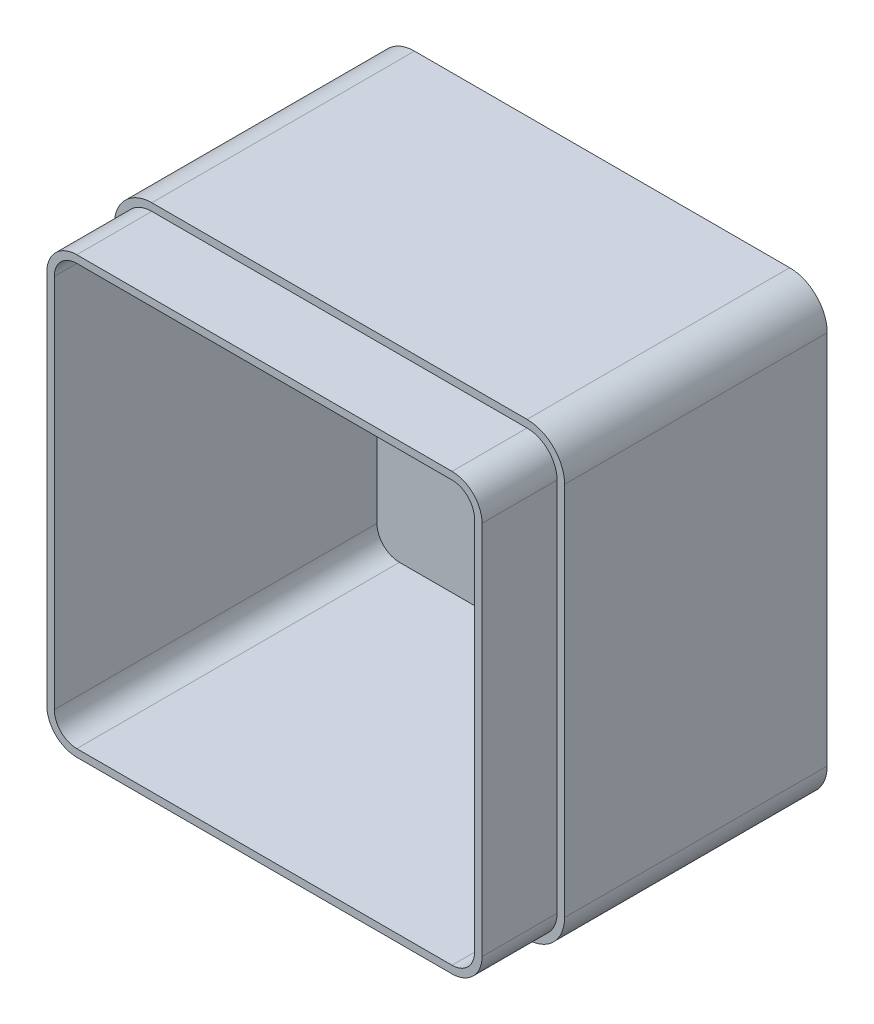
ISO-10303-21;
HEADER;
FILE_DESCRIPTION(('STEP AP214'),'2;1');
FILE_NAME('part.step','',(''),(''),'','','');
FILE_SCHEMA(('AUTOMOTIVE_DESIGN { 1 0 10303 214 1 1 1 1 }'));
ENDSEC;
DATA;
#1=APPLICATION_CONTEXT('core data for automotive mechanical design processes');
#2=APPLICATION_PROTOCOL_DEFINITION('international standard','automotive_design',2000,#1);
#3=PRODUCT_CONTEXT('',#1,'mechanical');
#4=PRODUCT('Part','Part','',(#3));
#5=PRODUCT_RELATED_PRODUCT_CATEGORY('part','',(#4));
#6=PRODUCT_DEFINITION_FORMATION('','',#4);
#7=PRODUCT_DEFINITION_CONTEXT('part definition',#1,'design');
#8=PRODUCT_DEFINITION('design','',#6,#7);
#9=PRODUCT_DEFINITION_SHAPE('','',#8);
#10=(LENGTH_UNIT() NAMED_UNIT(*) SI_UNIT(.MILLI.,.METRE.));
#11=(NAMED_UNIT(*) PLANE_ANGLE_UNIT() SI_UNIT($,.RADIAN.));
#12=(NAMED_UNIT(*) SI_UNIT($,.STERADIAN.) SOLID_ANGLE_UNIT());
#13=UNCERTAINTY_MEASURE_WITH_UNIT(LENGTH_MEASURE(1.E-05),#10,'distance_accuracy_value','');
#14=(GEOMETRIC_REPRESENTATION_CONTEXT(3) GLOBAL_UNCERTAINTY_ASSIGNED_CONTEXT((#13)) GLOBAL_UNIT_ASSIGNED_CONTEXT((#10,
#11,#12)) REPRESENTATION_CONTEXT('',''));
#15=CARTESIAN_POINT('',(0.,0.,0.));
#16=DIRECTION('',(0.,0.,1.));
#17=DIRECTION('',(1.,0.,0.));
#18=AXIS2_PLACEMENT_3D('',#15,#16,#17);
#19=CARTESIAN_POINT('',(0.,0.,90.));
#20=DIRECTION('',(0.,0.,1.));
#21=DIRECTION('',(1.,0.,0.));
#22=AXIS2_PLACEMENT_3D('',#19,#20,#21);
#23=PLANE('',#22);
#24=DIRECTION('',(0.,-1.,0.));
#25=VECTOR('',#24,1.);
#26=CARTESIAN_POINT('',(-116.,0.,90.));
#27=LINE('',#26,#25);
#28=CARTESIAN_POINT('',(-116.,110.,90.));
#29=VERTEX_POINT('',#28);
#30=CARTESIAN_POINT('',(-116.,9.99999999999999,90.));
#31=VERTEX_POINT('',#30);
#32=EDGE_CURVE('E391',#29,#31,#27,.T.);
#33=ORIENTED_EDGE('',*,*,#32,.F.);
#34=CARTESIAN_POINT('',(-110.,110.,90.));
#35=DIRECTION('',(0.,0.,1.));
#36=DIRECTION('',(1.,0.,0.));
#37=AXIS2_PLACEMENT_3D('',#34,#35,#36);
#38=CIRCLE('',#37,6.);
#39=CARTESIAN_POINT('',(-110.,116.,90.));
#40=VERTEX_POINT('',#39);
#41=EDGE_CURVE('E392',#40,#29,#38,.T.);
#42=ORIENTED_EDGE('',*,*,#41,.F.);
#43=DIRECTION('',(-1.,0.,0.));
#44=VECTOR('',#43,1.);
#45=CARTESIAN_POINT('',(0.,116.,90.));
#46=LINE('',#45,#44);
#47=CARTESIAN_POINT('',(-10.,116.,90.));
#48=VERTEX_POINT('',#47);
#49=EDGE_CURVE('E385',#48,#40,#46,.T.);
#50=ORIENTED_EDGE('',*,*,#49,.F.);
#51=CARTESIAN_POINT('',(-10.,110.,90.));
#52=DIRECTION('',(0.,0.,1.));
#53=DIRECTION('',(1.,0.,0.));
#54=AXIS2_PLACEMENT_3D('',#51,#52,#53);
#55=CIRCLE('',#54,6.);
#56=CARTESIAN_POINT('',(-4.,110.,90.));
#57=VERTEX_POINT('',#56);
#58=EDGE_CURVE('E374',#57,#48,#55,.T.);
#59=ORIENTED_EDGE('',*,*,#58,.F.);
#60=DIRECTION('',(0.,1.,0.));
#61=VECTOR('',#60,1.);
#62=CARTESIAN_POINT('',(-4.,0.,90.));
#63=LINE('',#62,#61);
#64=CARTESIAN_POINT('',(-4.,9.99999999999999,90.));
#65=VERTEX_POINT('',#64);
#66=EDGE_CURVE('E338',#65,#57,#63,.T.);
#67=ORIENTED_EDGE('',*,*,#66,.F.);
#68=CARTESIAN_POINT('',(-10.,10.,90.));
#69=DIRECTION('',(0.,0.,1.));
#70=DIRECTION('',(1.,0.,0.));
#71=AXIS2_PLACEMENT_3D('',#68,#69,#70);
#72=CIRCLE('',#71,6.);
#73=CARTESIAN_POINT('',(-9.99999999999999,4.,90.));
#74=VERTEX_POINT('',#73);
#75=EDGE_CURVE('E388',#74,#65,#72,.T.);
#76=ORIENTED_EDGE('',*,*,#75,.F.);
#77=DIRECTION('',(1.,0.,0.));
#78=VECTOR('',#77,1.);
#79=CARTESIAN_POINT('',(0.,4.,90.));
#80=LINE('',#79,#78);
#81=CARTESIAN_POINT('',(-110.,4.,90.));
#82=VERTEX_POINT('',#81);
#83=EDGE_CURVE('E381',#82,#74,#80,.T.);
#84=ORIENTED_EDGE('',*,*,#83,.F.);
#85=CARTESIAN_POINT('',(-110.,10.,90.));
#86=DIRECTION('',(0.,0.,1.));
#87=DIRECTION('',(1.,0.,0.));
#88=AXIS2_PLACEMENT_3D('',#85,#86,#87);
#89=CIRCLE('',#88,6.);
#90=EDGE_CURVE('E367',#31,#82,#89,.T.);
#91=ORIENTED_EDGE('',*,*,#90,.F.);
#92=EDGE_LOOP('',(#33,#42,#50,#59,#67,#76,#84,#91));
#93=FACE_BOUND('',#92,.T.);
#94=DIRECTION('',(-1.,0.,0.));
#95=VECTOR('',#94,1.);
#96=CARTESIAN_POINT('',(-10.,118.,90.));
#97=LINE('',#96,#95);
#98=CARTESIAN_POINT('',(-10.,118.,90.));
#99=VERTEX_POINT('',#98);
#100=CARTESIAN_POINT('',(-110.,118.,90.));
#101=VERTEX_POINT('',#100);
#102=EDGE_CURVE('E229',#99,#101,#97,.T.);
#103=ORIENTED_EDGE('',*,*,#102,.T.);
#104=CARTESIAN_POINT('',(-110.,110.,90.));
#105=DIRECTION('',(0.,0.,1.));
#106=DIRECTION('',(1.,0.,0.));
#107=AXIS2_PLACEMENT_3D('',#104,#105,#106);
#108=CIRCLE('',#107,8.);
#109=CARTESIAN_POINT('',(-118.,110.,90.));
#110=VERTEX_POINT('',#109);
#111=EDGE_CURVE('E256',#101,#110,#108,.T.);
#112=ORIENTED_EDGE('',*,*,#111,.T.);
#113=DIRECTION('',(0.,-1.,0.));
#114=VECTOR('',#113,1.);
#115=CARTESIAN_POINT('',(-118.,110.,90.));
#116=LINE('',#115,#114);
#117=CARTESIAN_POINT('',(-118.,9.99999999999999,90.));
#118=VERTEX_POINT('',#117);
#119=EDGE_CURVE('E206',#110,#118,#116,.T.);
#120=ORIENTED_EDGE('',*,*,#119,.T.);
#121=CARTESIAN_POINT('',(-110.,10.,90.));
#122=DIRECTION('',(0.,0.,1.));
#123=DIRECTION('',(1.,0.,0.));
#124=AXIS2_PLACEMENT_3D('',#121,#122,#123);
#125=CIRCLE('',#124,7.99999999999999);
#126=CARTESIAN_POINT('',(-110.,2.,90.));
#127=VERTEX_POINT('',#126);
#128=EDGE_CURVE('E55',#118,#127,#125,.T.);
#129=ORIENTED_EDGE('',*,*,#128,.T.);
#130=DIRECTION('',(1.,0.,0.));
#131=VECTOR('',#130,1.);
#132=CARTESIAN_POINT('',(-110.,2.,90.));
#133=LINE('',#132,#131);
#134=CARTESIAN_POINT('',(-9.99999999999999,2.,90.));
#135=VERTEX_POINT('',#134);
#136=EDGE_CURVE('E263',#127,#135,#133,.T.);
#137=ORIENTED_EDGE('',*,*,#136,.T.);
#138=CARTESIAN_POINT('',(-10.,10.,90.));
#139=DIRECTION('',(0.,0.,1.));
#140=DIRECTION('',(1.,0.,0.));
#141=AXIS2_PLACEMENT_3D('',#138,#139,#140);
#142=CIRCLE('',#141,8.);
#143=CARTESIAN_POINT('',(-2.,10.,90.));
#144=VERTEX_POINT('',#143);
#145=EDGE_CURVE('E267',#135,#144,#142,.T.);
#146=ORIENTED_EDGE('',*,*,#145,.T.);
#147=DIRECTION('',(0.,1.,0.));
#148=VECTOR('',#147,1.);
#149=CARTESIAN_POINT('',(-2.,9.99999999999999,90.));
#150=LINE('',#149,#148);
#151=CARTESIAN_POINT('',(-2.,110.,90.));
#152=VERTEX_POINT('',#151);
#153=EDGE_CURVE('E271',#144,#152,#150,.T.);
#154=ORIENTED_EDGE('',*,*,#153,.T.);
#155=CARTESIAN_POINT('',(-10.,110.,90.));
#156=DIRECTION('',(0.,0.,1.));
#157=DIRECTION('',(1.,0.,0.));
#158=AXIS2_PLACEMENT_3D('',#155,#156,#157);
#159=CIRCLE('',#158,7.99999999999999);
#160=EDGE_CURVE('E233',#152,#99,#159,.T.);
#161=ORIENTED_EDGE('',*,*,#160,.T.);
#162=EDGE_LOOP('',(#103,#112,#120,#129,#137,#146,#154,#161));
#163=FACE_BOUND('',#162,.T.);
#164=ADVANCED_FACE('F39',(#93,#163),#23,.T.);
#165=CARTESIAN_POINT('',(-4.,0.,90.));
#166=DIRECTION('',(-1.,0.,0.));
#167=DIRECTION('',(0.,0.,1.));
#168=AXIS2_PLACEMENT_3D('',#165,#166,#167);
#169=PLANE('',#168);
#170=ORIENTED_EDGE('',*,*,#66,.T.);
#171=DIRECTION('',(0.,0.,1.));
#172=VECTOR('',#171,1.);
#173=CARTESIAN_POINT('',(-4.,110.,90.));
#174=LINE('',#173,#172);
#175=CARTESIAN_POINT('',(-4.,110.,4.));
#176=VERTEX_POINT('',#175);
#177=EDGE_CURVE('E326',#176,#57,#174,.T.);
#178=ORIENTED_EDGE('',*,*,#177,.F.);
#179=DIRECTION('',(0.,1.,0.));
#180=VECTOR('',#179,1.);
#181=CARTESIAN_POINT('',(-4.,0.,4.));
#182=LINE('',#181,#180);
#183=CARTESIAN_POINT('',(-4.,9.99999999999999,4.));
#184=VERTEX_POINT('',#183);
#185=EDGE_CURVE('E320',#184,#176,#182,.T.);
#186=ORIENTED_EDGE('',*,*,#185,.F.);
#187=DIRECTION('',(0.,0.,1.));
#188=VECTOR('',#187,1.);
#189=CARTESIAN_POINT('',(-4.,9.99999999999999,90.));
#190=LINE('',#189,#188);
#191=EDGE_CURVE('E321',#65,#184,#190,.F.);
#192=ORIENTED_EDGE('',*,*,#191,.F.);
#193=EDGE_LOOP('',(#170,#178,#186,#192));
#194=FACE_BOUND('',#193,.T.);
#195=ADVANCED_FACE('F504',(#194),#169,.T.);
#196=CARTESIAN_POINT('',(0.,116.,90.));
#197=DIRECTION('',(0.,-1.,0.));
#198=DIRECTION('',(1.,0.,0.));
#199=AXIS2_PLACEMENT_3D('',#196,#197,#198);
#200=PLANE('',#199);
#201=DIRECTION('',(-1.,0.,0.));
#202=VECTOR('',#201,1.);
#203=CARTESIAN_POINT('',(0.,116.,4.));
#204=LINE('',#203,#202);
#205=CARTESIAN_POINT('',(-10.,116.,4.));
#206=VERTEX_POINT('',#205);
#207=CARTESIAN_POINT('',(-110.,116.,4.));
#208=VERTEX_POINT('',#207);
#209=EDGE_CURVE('E330',#206,#208,#204,.T.);
#210=ORIENTED_EDGE('',*,*,#209,.F.);
#211=DIRECTION('',(0.,0.,1.));
#212=VECTOR('',#211,1.);
#213=CARTESIAN_POINT('',(-10.,116.,90.));
#214=LINE('',#213,#212);
#215=EDGE_CURVE('E363',#48,#206,#214,.F.);
#216=ORIENTED_EDGE('',*,*,#215,.F.);
#217=ORIENTED_EDGE('',*,*,#49,.T.);
#218=DIRECTION('',(0.,0.,1.));
#219=VECTOR('',#218,1.);
#220=CARTESIAN_POINT('',(-110.,116.,90.));
#221=LINE('',#220,#219);
#222=EDGE_CURVE('E333',#208,#40,#221,.T.);
#223=ORIENTED_EDGE('',*,*,#222,.F.);
#224=EDGE_LOOP('',(#210,#216,#217,#223));
#225=FACE_BOUND('',#224,.T.);
#226=ADVANCED_FACE('F509',(#225),#200,.T.);
#227=CARTESIAN_POINT('',(-116.,0.,90.));
#228=DIRECTION('',(1.,0.,0.));
#229=DIRECTION('',(0.,0.,-1.));
#230=AXIS2_PLACEMENT_3D('',#227,#228,#229);
#231=PLANE('',#230);
#232=DIRECTION('',(0.,-1.,0.));
#233=VECTOR('',#232,1.);
#234=CARTESIAN_POINT('',(-116.,0.,4.));
#235=LINE('',#234,#233);
#236=CARTESIAN_POINT('',(-116.,110.,4.));
#237=VERTEX_POINT('',#236);
#238=CARTESIAN_POINT('',(-116.,9.99999999999999,4.));
#239=VERTEX_POINT('',#238);
#240=EDGE_CURVE('E339',#237,#239,#235,.T.);
#241=ORIENTED_EDGE('',*,*,#240,.F.);
#242=DIRECTION('',(0.,0.,-1.));
#243=VECTOR('',#242,1.);
#244=CARTESIAN_POINT('',(-116.,110.,90.));
#245=LINE('',#244,#243);
#246=EDGE_CURVE('E343',#29,#237,#245,.T.);
#247=ORIENTED_EDGE('',*,*,#246,.F.);
#248=ORIENTED_EDGE('',*,*,#32,.T.);
#249=DIRECTION('',(0.,0.,-1.));
#250=VECTOR('',#249,1.);
#251=CARTESIAN_POINT('',(-116.,9.99999999999999,90.));
#252=LINE('',#251,#250);
#253=EDGE_CURVE('E371',#239,#31,#252,.F.);
#254=ORIENTED_EDGE('',*,*,#253,.F.);
#255=EDGE_LOOP('',(#241,#247,#248,#254));
#256=FACE_BOUND('',#255,.T.);
#257=ADVANCED_FACE('F538',(#256),#231,.T.);
#258=CARTESIAN_POINT('',(0.,4.,90.));
#259=DIRECTION('',(0.,1.,0.));
#260=DIRECTION('',(0.,0.,1.));
#261=AXIS2_PLACEMENT_3D('',#258,#259,#260);
#262=PLANE('',#261);
#263=ORIENTED_EDGE('',*,*,#83,.T.);
#264=DIRECTION('',(0.,0.,1.));
#265=VECTOR('',#264,1.);
#266=CARTESIAN_POINT('',(-9.99999999999999,4.,90.));
#267=LINE('',#266,#265);
#268=CARTESIAN_POINT('',(-9.99999999999999,4.,4.));
#269=VERTEX_POINT('',#268);
#270=EDGE_CURVE('E378',#269,#74,#267,.T.);
#271=ORIENTED_EDGE('',*,*,#270,.F.);
#272=DIRECTION('',(1.,0.,0.));
#273=VECTOR('',#272,1.);
#274=CARTESIAN_POINT('',(0.,4.,4.));
#275=LINE('',#274,#273);
#276=CARTESIAN_POINT('',(-110.,4.,4.));
#277=VERTEX_POINT('',#276);
#278=EDGE_CURVE('E334',#277,#269,#275,.T.);
#279=ORIENTED_EDGE('',*,*,#278,.F.);
#280=DIRECTION('',(0.,0.,1.));
#281=VECTOR('',#280,1.);
#282=CARTESIAN_POINT('',(-110.,4.,90.));
#283=LINE('',#282,#281);
#284=EDGE_CURVE('E357',#82,#277,#283,.F.);
#285=ORIENTED_EDGE('',*,*,#284,.F.);
#286=EDGE_LOOP('',(#263,#271,#279,#285));
#287=FACE_BOUND('',#286,.T.);
#288=ADVANCED_FACE('F534',(#287),#262,.T.);
#289=CARTESIAN_POINT('',(0.,0.,4.));
#290=DIRECTION('',(0.,0.,1.));
#291=DIRECTION('',(1.,0.,0.));
#292=AXIS2_PLACEMENT_3D('',#289,#290,#291);
#293=PLANE('',#292);
#294=ORIENTED_EDGE('',*,*,#278,.T.);
#295=CARTESIAN_POINT('',(-10.,10.,4.));
#296=DIRECTION('',(0.,0.,1.));
#297=DIRECTION('',(1.,0.,0.));
#298=AXIS2_PLACEMENT_3D('',#295,#296,#297);
#299=CIRCLE('',#298,6.);
#300=EDGE_CURVE('E350',#184,#269,#299,.F.);
#301=ORIENTED_EDGE('',*,*,#300,.F.);
#302=ORIENTED_EDGE('',*,*,#185,.T.);
#303=CARTESIAN_POINT('',(-10.,110.,4.));
#304=DIRECTION('',(0.,0.,1.));
#305=DIRECTION('',(1.,0.,0.));
#306=AXIS2_PLACEMENT_3D('',#303,#304,#305);
#307=CIRCLE('',#306,6.);
#308=EDGE_CURVE('E354',#206,#176,#307,.F.);
#309=ORIENTED_EDGE('',*,*,#308,.F.);
#310=ORIENTED_EDGE('',*,*,#209,.T.);
#311=CARTESIAN_POINT('',(-110.,110.,4.));
#312=DIRECTION('',(0.,0.,1.));
#313=DIRECTION('',(1.,0.,0.));
#314=AXIS2_PLACEMENT_3D('',#311,#312,#313);
#315=CIRCLE('',#314,6.);
#316=EDGE_CURVE('E344',#237,#208,#315,.F.);
#317=ORIENTED_EDGE('',*,*,#316,.F.);
#318=ORIENTED_EDGE('',*,*,#240,.T.);
#319=CARTESIAN_POINT('',(-110.,10.,4.));
#320=DIRECTION('',(0.,0.,1.));
#321=DIRECTION('',(1.,0.,0.));
#322=AXIS2_PLACEMENT_3D('',#319,#320,#321);
#323=CIRCLE('',#322,6.);
#324=EDGE_CURVE('E340',#277,#239,#323,.F.);
#325=ORIENTED_EDGE('',*,*,#324,.F.);
#326=EDGE_LOOP('',(#294,#301,#302,#309,#310,#317,#318,#325));
#327=FACE_BOUND('',#326,.T.);
#328=ADVANCED_FACE('F530',(#327),#293,.T.);
#329=CARTESIAN_POINT('',(-110.,10.,90.));
#330=DIRECTION('',(0.,0.,-1.));
#331=DIRECTION('',(-1.,0.,0.));
#332=AXIS2_PLACEMENT_3D('',#329,#330,#331);
#333=CYLINDRICAL_SURFACE('',#332,6.);
#334=ORIENTED_EDGE('',*,*,#90,.T.);
#335=ORIENTED_EDGE('',*,*,#284,.T.);
#336=ORIENTED_EDGE('',*,*,#324,.T.);
#337=ORIENTED_EDGE('',*,*,#253,.T.);
#338=EDGE_LOOP('',(#334,#335,#336,#337));
#339=FACE_BOUND('',#338,.T.);
#340=ADVANCED_FACE('F526',(#339),#333,.F.);
#341=CARTESIAN_POINT('',(-110.,110.,90.));
#342=DIRECTION('',(0.,0.,-1.));
#343=DIRECTION('',(-1.,0.,0.));
#344=AXIS2_PLACEMENT_3D('',#341,#342,#343);
#345=CYLINDRICAL_SURFACE('',#344,6.);
#346=ORIENTED_EDGE('',*,*,#41,.T.);
#347=ORIENTED_EDGE('',*,*,#246,.T.);
#348=ORIENTED_EDGE('',*,*,#316,.T.);
#349=ORIENTED_EDGE('',*,*,#222,.T.);
#350=EDGE_LOOP('',(#346,#347,#348,#349));
#351=FACE_BOUND('',#350,.T.);
#352=ADVANCED_FACE('F522',(#351),#345,.F.);
#353=CARTESIAN_POINT('',(-10.,10.,90.));
#354=DIRECTION('',(0.,0.,-1.));
#355=DIRECTION('',(-1.,0.,0.));
#356=AXIS2_PLACEMENT_3D('',#353,#354,#355);
#357=CYLINDRICAL_SURFACE('',#356,6.);
#358=ORIENTED_EDGE('',*,*,#75,.T.);
#359=ORIENTED_EDGE('',*,*,#191,.T.);
#360=ORIENTED_EDGE('',*,*,#300,.T.);
#361=ORIENTED_EDGE('',*,*,#270,.T.);
#362=EDGE_LOOP('',(#358,#359,#360,#361));
#363=FACE_BOUND('',#362,.T.);
#364=ADVANCED_FACE('F518',(#363),#357,.F.);
#365=CARTESIAN_POINT('',(-10.,110.,90.));
#366=DIRECTION('',(0.,0.,-1.));
#367=DIRECTION('',(-1.,0.,0.));
#368=AXIS2_PLACEMENT_3D('',#365,#366,#367);
#369=CYLINDRICAL_SURFACE('',#368,6.);
#370=ORIENTED_EDGE('',*,*,#58,.T.);
#371=ORIENTED_EDGE('',*,*,#215,.T.);
#372=ORIENTED_EDGE('',*,*,#308,.T.);
#373=ORIENTED_EDGE('',*,*,#177,.T.);
#374=EDGE_LOOP('',(#370,#371,#372,#373));
#375=FACE_BOUND('',#374,.T.);
#376=ADVANCED_FACE('F515',(#375),#369,.F.);
#377=CARTESIAN_POINT('',(-110.,110.,70.));
#378=DIRECTION('',(0.,0.,1.));
#379=DIRECTION('',(1.,0.,0.));
#380=AXIS2_PLACEMENT_3D('',#377,#378,#379);
#381=PLANE('',#380);
#382=DIRECTION('',(-1.,0.,0.));
#383=VECTOR('',#382,1.);
#384=CARTESIAN_POINT('',(-10.,118.,70.));
#385=LINE('',#384,#383);
#386=CARTESIAN_POINT('',(-10.,118.,70.));
#387=VERTEX_POINT('',#386);
#388=CARTESIAN_POINT('',(-110.,118.,70.));
#389=VERTEX_POINT('',#388);
#390=EDGE_CURVE('E213',#387,#389,#385,.T.);
#391=ORIENTED_EDGE('',*,*,#390,.F.);
#392=CARTESIAN_POINT('',(-10.,110.,70.));
#393=DIRECTION('',(0.,0.,1.));
#394=DIRECTION('',(1.,0.,0.));
#395=AXIS2_PLACEMENT_3D('',#392,#393,#394);
#396=CIRCLE('',#395,7.99999999999999);
#397=CARTESIAN_POINT('',(-2.,110.,70.));
#398=VERTEX_POINT('',#397);
#399=EDGE_CURVE('E250',#398,#387,#396,.T.);
#400=ORIENTED_EDGE('',*,*,#399,.F.);
#401=DIRECTION('',(0.,1.,0.));
#402=VECTOR('',#401,1.);
#403=CARTESIAN_POINT('',(-2.,9.99999999999999,70.));
#404=LINE('',#403,#402);
#405=CARTESIAN_POINT('',(-2.,10.,70.));
#406=VERTEX_POINT('',#405);
#407=EDGE_CURVE('E246',#406,#398,#404,.T.);
#408=ORIENTED_EDGE('',*,*,#407,.F.);
#409=CARTESIAN_POINT('',(-10.,10.,70.));
#410=DIRECTION('',(0.,0.,1.));
#411=DIRECTION('',(1.,0.,0.));
#412=AXIS2_PLACEMENT_3D('',#409,#410,#411);
#413=CIRCLE('',#412,8.);
#414=CARTESIAN_POINT('',(-9.99999999999999,2.,70.));
#415=VERTEX_POINT('',#414);
#416=EDGE_CURVE('E242',#415,#406,#413,.T.);
#417=ORIENTED_EDGE('',*,*,#416,.F.);
#418=DIRECTION('',(1.,0.,0.));
#419=VECTOR('',#418,1.);
#420=CARTESIAN_POINT('',(-110.,2.,70.));
#421=LINE('',#420,#419);
#422=CARTESIAN_POINT('',(-110.,2.,70.));
#423=VERTEX_POINT('',#422);
#424=EDGE_CURVE('E238',#423,#415,#421,.T.);
#425=ORIENTED_EDGE('',*,*,#424,.F.);
#426=CARTESIAN_POINT('',(-110.,10.,70.));
#427=DIRECTION('',(0.,0.,1.));
#428=DIRECTION('',(1.,0.,0.));
#429=AXIS2_PLACEMENT_3D('',#426,#427,#428);
#430=CIRCLE('',#429,7.99999999999999);
#431=CARTESIAN_POINT('',(-118.,9.99999999999999,70.));
#432=VERTEX_POINT('',#431);
#433=EDGE_CURVE('E223',#432,#423,#430,.T.);
#434=ORIENTED_EDGE('',*,*,#433,.F.);
#435=DIRECTION('',(0.,-1.,0.));
#436=VECTOR('',#435,1.);
#437=CARTESIAN_POINT('',(-118.,110.,70.));
#438=LINE('',#437,#436);
#439=CARTESIAN_POINT('',(-118.,110.,70.));
#440=VERTEX_POINT('',#439);
#441=EDGE_CURVE('E204',#440,#432,#438,.T.);
#442=ORIENTED_EDGE('',*,*,#441,.F.);
#443=CARTESIAN_POINT('',(-110.,110.,70.));
#444=DIRECTION('',(0.,0.,1.));
#445=DIRECTION('',(1.,0.,0.));
#446=AXIS2_PLACEMENT_3D('',#443,#444,#445);
#447=CIRCLE('',#446,8.);
#448=EDGE_CURVE('E219',#389,#440,#447,.T.);
#449=ORIENTED_EDGE('',*,*,#448,.F.);
#450=EDGE_LOOP('',(#391,#400,#408,#417,#425,#434,#442,#449));
#451=FACE_BOUND('',#450,.T.);
#452=CARTESIAN_POINT('',(-110.,110.,70.));
#453=DIRECTION('',(0.,0.,1.));
#454=DIRECTION('',(1.,0.,0.));
#455=AXIS2_PLACEMENT_3D('',#452,#453,#454);
#456=CIRCLE('',#455,9.99999999999999);
#457=CARTESIAN_POINT('',(-110.,120.,70.));
#458=VERTEX_POINT('',#457);
#459=CARTESIAN_POINT('',(-120.,110.,70.));
#460=VERTEX_POINT('',#459);
#461=EDGE_CURVE('E280',#458,#460,#456,.T.);
#462=ORIENTED_EDGE('',*,*,#461,.T.);
#463=DIRECTION('',(0.,-1.,0.));
#464=VECTOR('',#463,1.);
#465=CARTESIAN_POINT('',(-120.,110.,70.));
#466=LINE('',#465,#464);
#467=CARTESIAN_POINT('',(-120.,9.99999999999999,70.));
#468=VERTEX_POINT('',#467);
#469=EDGE_CURVE('E300',#460,#468,#466,.T.);
#470=ORIENTED_EDGE('',*,*,#469,.T.);
#471=CARTESIAN_POINT('',(-110.,10.,70.));
#472=DIRECTION('',(0.,0.,1.));
#473=DIRECTION('',(1.,0.,0.));
#474=AXIS2_PLACEMENT_3D('',#471,#472,#473);
#475=CIRCLE('',#474,9.99999999999999);
#476=CARTESIAN_POINT('',(-110.,0.,70.));
#477=VERTEX_POINT('',#476);
#478=EDGE_CURVE('E303',#468,#477,#475,.T.);
#479=ORIENTED_EDGE('',*,*,#478,.T.);
#480=DIRECTION('',(1.,0.,0.));
#481=VECTOR('',#480,1.);
#482=CARTESIAN_POINT('',(-110.,0.,70.));
#483=LINE('',#482,#481);
#484=CARTESIAN_POINT('',(-10.,0.,70.));
#485=VERTEX_POINT('',#484);
#486=EDGE_CURVE('E306',#477,#485,#483,.T.);
#487=ORIENTED_EDGE('',*,*,#486,.T.);
#488=CARTESIAN_POINT('',(-10.,10.,70.));
#489=DIRECTION('',(0.,0.,1.));
#490=DIRECTION('',(1.,0.,0.));
#491=AXIS2_PLACEMENT_3D('',#488,#489,#490);
#492=CIRCLE('',#491,10.);
#493=CARTESIAN_POINT('',(0.,10.,70.));
#494=VERTEX_POINT('',#493);
#495=EDGE_CURVE('E309',#485,#494,#492,.T.);
#496=ORIENTED_EDGE('',*,*,#495,.T.);
#497=DIRECTION('',(0.,1.,0.));
#498=VECTOR('',#497,1.);
#499=CARTESIAN_POINT('',(0.,10.,70.));
#500=LINE('',#499,#498);
#501=CARTESIAN_POINT('',(0.,110.,70.));
#502=VERTEX_POINT('',#501);
#503=EDGE_CURVE('E63',#494,#502,#500,.T.);
#504=ORIENTED_EDGE('',*,*,#503,.T.);
#505=CARTESIAN_POINT('',(-10.,110.,70.));
#506=DIRECTION('',(0.,0.,1.));
#507=DIRECTION('',(1.,0.,0.));
#508=AXIS2_PLACEMENT_3D('',#505,#506,#507);
#509=CIRCLE('',#508,9.99999999999999);
#510=CARTESIAN_POINT('',(-10.,120.,70.));
#511=VERTEX_POINT('',#510);
#512=EDGE_CURVE('E314',#502,#511,#509,.T.);
#513=ORIENTED_EDGE('',*,*,#512,.T.);
#514=DIRECTION('',(-1.,0.,0.));
#515=VECTOR('',#514,1.);
#516=CARTESIAN_POINT('',(-10.,120.,70.));
#517=LINE('',#516,#515);
#518=EDGE_CURVE('E317',#511,#458,#517,.T.);
#519=ORIENTED_EDGE('',*,*,#518,.T.);
#520=EDGE_LOOP('',(#462,#470,#479,#487,#496,#504,#513,#519));
#521=FACE_BOUND('',#520,.T.);
#522=ADVANCED_FACE('F218',(#451,#521),#381,.T.);
#523=CARTESIAN_POINT('',(-110.,110.,70.));
#524=DIRECTION('',(0.,0.,1.));
#525=DIRECTION('',(1.,0.,0.));
#526=AXIS2_PLACEMENT_3D('',#523,#524,#525);
#527=CYLINDRICAL_SURFACE('',#526,8.);
#528=ORIENTED_EDGE('',*,*,#111,.F.);
#529=DIRECTION('',(0.,0.,1.));
#530=VECTOR('',#529,1.);
#531=CARTESIAN_POINT('',(-110.,118.,70.));
#532=LINE('',#531,#530);
#533=EDGE_CURVE('E227',#389,#101,#532,.T.);
#534=ORIENTED_EDGE('',*,*,#533,.F.);
#535=ORIENTED_EDGE('',*,*,#448,.T.);
#536=DIRECTION('',(0.,0.,1.));
#537=VECTOR('',#536,1.);
#538=CARTESIAN_POINT('',(-118.,110.,70.));
#539=LINE('',#538,#537);
#540=EDGE_CURVE('E201',#440,#110,#539,.T.);
#541=ORIENTED_EDGE('',*,*,#540,.T.);
#542=EDGE_LOOP('',(#528,#534,#535,#541));
#543=FACE_BOUND('',#542,.T.);
#544=ADVANCED_FACE('F226',(#543),#527,.T.);
#545=CARTESIAN_POINT('',(-10.,118.,70.));
#546=DIRECTION('',(0.,1.,0.));
#547=DIRECTION('',(0.,0.,1.));
#548=AXIS2_PLACEMENT_3D('',#545,#546,#547);
#549=PLANE('',#548);
#550=ORIENTED_EDGE('',*,*,#102,.F.);
#551=DIRECTION('',(0.,0.,1.));
#552=VECTOR('',#551,1.);
#553=CARTESIAN_POINT('',(-10.,118.,70.));
#554=LINE('',#553,#552);
#555=EDGE_CURVE('E281',#387,#99,#554,.T.);
#556=ORIENTED_EDGE('',*,*,#555,.F.);
#557=ORIENTED_EDGE('',*,*,#390,.T.);
#558=ORIENTED_EDGE('',*,*,#533,.T.);
#559=EDGE_LOOP('',(#550,#556,#557,#558));
#560=FACE_BOUND('',#559,.T.);
#561=ADVANCED_FACE('F549',(#560),#549,.T.);
#562=CARTESIAN_POINT('',(-10.,110.,70.));
#563=DIRECTION('',(0.,0.,1.));
#564=DIRECTION('',(1.,0.,0.));
#565=AXIS2_PLACEMENT_3D('',#562,#563,#564);
#566=CYLINDRICAL_SURFACE('',#565,7.99999999999999);
#567=ORIENTED_EDGE('',*,*,#160,.F.);
#568=DIRECTION('',(0.,0.,1.));
#569=VECTOR('',#568,1.);
#570=CARTESIAN_POINT('',(-2.,110.,70.));
#571=LINE('',#570,#569);
#572=EDGE_CURVE('E284',#398,#152,#571,.T.);
#573=ORIENTED_EDGE('',*,*,#572,.F.);
#574=ORIENTED_EDGE('',*,*,#399,.T.);
#575=ORIENTED_EDGE('',*,*,#555,.T.);
#576=EDGE_LOOP('',(#567,#573,#574,#575));
#577=FACE_BOUND('',#576,.T.);
#578=ADVANCED_FACE('F564',(#577),#566,.T.);
#579=CARTESIAN_POINT('',(-2.,9.99999999999999,70.));
#580=DIRECTION('',(1.,0.,0.));
#581=DIRECTION('',(0.,0.,-1.));
#582=AXIS2_PLACEMENT_3D('',#579,#580,#581);
#583=PLANE('',#582);
#584=ORIENTED_EDGE('',*,*,#153,.F.);
#585=DIRECTION('',(0.,0.,1.));
#586=VECTOR('',#585,1.);
#587=CARTESIAN_POINT('',(-2.,10.,70.));
#588=LINE('',#587,#586);
#589=EDGE_CURVE('E287',#406,#144,#588,.T.);
#590=ORIENTED_EDGE('',*,*,#589,.F.);
#591=ORIENTED_EDGE('',*,*,#407,.T.);
#592=ORIENTED_EDGE('',*,*,#572,.T.);
#593=EDGE_LOOP('',(#584,#590,#591,#592));
#594=FACE_BOUND('',#593,.T.);
#595=ADVANCED_FACE('F560',(#594),#583,.T.);
#596=CARTESIAN_POINT('',(-10.,10.,70.));
#597=DIRECTION('',(0.,0.,1.));
#598=DIRECTION('',(1.,0.,0.));
#599=AXIS2_PLACEMENT_3D('',#596,#597,#598);
#600=CYLINDRICAL_SURFACE('',#599,8.);
#601=ORIENTED_EDGE('',*,*,#145,.F.);
#602=DIRECTION('',(0.,0.,1.));
#603=VECTOR('',#602,1.);
#604=CARTESIAN_POINT('',(-9.99999999999999,2.,70.));
#605=LINE('',#604,#603);
#606=EDGE_CURVE('E290',#415,#135,#605,.T.);
#607=ORIENTED_EDGE('',*,*,#606,.F.);
#608=ORIENTED_EDGE('',*,*,#416,.T.);
#609=ORIENTED_EDGE('',*,*,#589,.T.);
#610=EDGE_LOOP('',(#601,#607,#608,#609));
#611=FACE_BOUND('',#610,.T.);
#612=ADVANCED_FACE('F556',(#611),#600,.T.);
#613=CARTESIAN_POINT('',(-110.,2.,70.));
#614=DIRECTION('',(0.,-1.,0.));
#615=DIRECTION('',(1.,0.,0.));
#616=AXIS2_PLACEMENT_3D('',#613,#614,#615);
#617=PLANE('',#616);
#618=ORIENTED_EDGE('',*,*,#136,.F.);
#619=DIRECTION('',(0.,0.,1.));
#620=VECTOR('',#619,1.);
#621=CARTESIAN_POINT('',(-110.,2.,70.));
#622=LINE('',#621,#620);
#623=EDGE_CURVE('E293',#423,#127,#622,.T.);
#624=ORIENTED_EDGE('',*,*,#623,.F.);
#625=ORIENTED_EDGE('',*,*,#424,.T.);
#626=ORIENTED_EDGE('',*,*,#606,.T.);
#627=EDGE_LOOP('',(#618,#624,#625,#626));
#628=FACE_BOUND('',#627,.T.);
#629=ADVANCED_FACE('F553',(#628),#617,.T.);
#630=CARTESIAN_POINT('',(-110.,10.,70.));
#631=DIRECTION('',(0.,0.,1.));
#632=DIRECTION('',(1.,0.,0.));
#633=AXIS2_PLACEMENT_3D('',#630,#631,#632);
#634=CYLINDRICAL_SURFACE('',#633,7.99999999999999);
#635=ORIENTED_EDGE('',*,*,#128,.F.);
#636=DIRECTION('',(0.,0.,1.));
#637=VECTOR('',#636,1.);
#638=CARTESIAN_POINT('',(-118.,9.99999999999999,70.));
#639=LINE('',#638,#637);
#640=EDGE_CURVE('E212',#432,#118,#639,.T.);
#641=ORIENTED_EDGE('',*,*,#640,.F.);
#642=ORIENTED_EDGE('',*,*,#433,.T.);
#643=ORIENTED_EDGE('',*,*,#623,.T.);
#644=EDGE_LOOP('',(#635,#641,#642,#643));
#645=FACE_BOUND('',#644,.T.);
#646=ADVANCED_FACE('F499',(#645),#634,.T.);
#647=CARTESIAN_POINT('',(-118.,110.,70.));
#648=DIRECTION('',(-1.,0.,0.));
#649=DIRECTION('',(0.,0.,1.));
#650=AXIS2_PLACEMENT_3D('',#647,#648,#649);
#651=PLANE('',#650);
#652=ORIENTED_EDGE('',*,*,#119,.F.);
#653=ORIENTED_EDGE('',*,*,#540,.F.);
#654=ORIENTED_EDGE('',*,*,#441,.T.);
#655=ORIENTED_EDGE('',*,*,#640,.T.);
#656=EDGE_LOOP('',(#652,#653,#654,#655));
#657=FACE_BOUND('',#656,.T.);
#658=ADVANCED_FACE('F203',(#657),#651,.T.);
#659=CARTESIAN_POINT('',(0.,0.,0.));
#660=DIRECTION('',(0.,0.,1.));
#661=DIRECTION('',(1.,0.,0.));
#662=AXIS2_PLACEMENT_3D('',#659,#660,#661);
#663=PLANE('',#662);
#664=DIRECTION('',(1.,0.,0.));
#665=VECTOR('',#664,1.);
#666=CARTESIAN_POINT('',(0.,0.,0.));
#667=LINE('',#666,#665);
#668=CARTESIAN_POINT('',(-110.,0.,0.));
#669=VERTEX_POINT('',#668);
#670=CARTESIAN_POINT('',(-10.,0.,0.));
#671=VERTEX_POINT('',#670);
#672=EDGE_CURVE('E416',#669,#671,#667,.T.);
#673=ORIENTED_EDGE('',*,*,#672,.F.);
#674=CARTESIAN_POINT('',(-110.,10.,0.));
#675=DIRECTION('',(0.,0.,1.));
#676=DIRECTION('',(1.,0.,0.));
#677=AXIS2_PLACEMENT_3D('',#674,#675,#676);
#678=CIRCLE('',#677,10.);
#679=CARTESIAN_POINT('',(-120.,9.99999999999999,0.));
#680=VERTEX_POINT('',#679);
#681=EDGE_CURVE('E436',#669,#680,#678,.F.);
#682=ORIENTED_EDGE('',*,*,#681,.T.);
#683=DIRECTION('',(0.,-1.,0.));
#684=VECTOR('',#683,1.);
#685=CARTESIAN_POINT('',(-120.,0.,0.));
#686=LINE('',#685,#684);
#687=CARTESIAN_POINT('',(-120.,110.,0.));
#688=VERTEX_POINT('',#687);
#689=EDGE_CURVE('E412',#688,#680,#686,.T.);
#690=ORIENTED_EDGE('',*,*,#689,.F.);
#691=CARTESIAN_POINT('',(-110.,110.,0.));
#692=DIRECTION('',(0.,0.,1.));
#693=DIRECTION('',(1.,0.,0.));
#694=AXIS2_PLACEMENT_3D('',#691,#692,#693);
#695=CIRCLE('',#694,10.);
#696=CARTESIAN_POINT('',(-110.,120.,0.));
#697=VERTEX_POINT('',#696);
#698=EDGE_CURVE('E433',#688,#697,#695,.F.);
#699=ORIENTED_EDGE('',*,*,#698,.T.);
#700=DIRECTION('',(-1.,0.,0.));
#701=VECTOR('',#700,1.);
#702=CARTESIAN_POINT('',(0.,120.,0.));
#703=LINE('',#702,#701);
#704=CARTESIAN_POINT('',(-10.,120.,0.));
#705=VERTEX_POINT('',#704);
#706=EDGE_CURVE('E408',#705,#697,#703,.T.);
#707=ORIENTED_EDGE('',*,*,#706,.F.);
#708=CARTESIAN_POINT('',(-10.,110.,0.));
#709=DIRECTION('',(0.,0.,1.));
#710=DIRECTION('',(1.,0.,0.));
#711=AXIS2_PLACEMENT_3D('',#708,#709,#710);
#712=CIRCLE('',#711,10.);
#713=CARTESIAN_POINT('',(0.,110.,0.));
#714=VERTEX_POINT('',#713);
#715=EDGE_CURVE('E427',#705,#714,#712,.F.);
#716=ORIENTED_EDGE('',*,*,#715,.T.);
#717=DIRECTION('',(0.,1.,0.));
#718=VECTOR('',#717,1.);
#719=CARTESIAN_POINT('',(0.,0.,0.));
#720=LINE('',#719,#718);
#721=CARTESIAN_POINT('',(0.,10.,0.));
#722=VERTEX_POINT('',#721);
#723=EDGE_CURVE('E325',#722,#714,#720,.T.);
#724=ORIENTED_EDGE('',*,*,#723,.F.);
#725=CARTESIAN_POINT('',(-10.,10.,0.));
#726=DIRECTION('',(0.,0.,1.));
#727=DIRECTION('',(1.,0.,0.));
#728=AXIS2_PLACEMENT_3D('',#725,#726,#727);
#729=CIRCLE('',#728,10.);
#730=EDGE_CURVE('E430',#722,#671,#729,.F.);
#731=ORIENTED_EDGE('',*,*,#730,.T.);
#732=EDGE_LOOP('',(#673,#682,#690,#699,#707,#716,#724,#731));
#733=FACE_BOUND('',#732,.T.);
#734=ADVANCED_FACE('F492',(#733),#663,.F.);
#735=CARTESIAN_POINT('',(-10.,10.,90.));
#736=DIRECTION('',(0.,0.,-1.));
#737=DIRECTION('',(-1.,0.,0.));
#738=AXIS2_PLACEMENT_3D('',#735,#736,#737);
#739=CYLINDRICAL_SURFACE('',#738,10.);
#740=DIRECTION('',(0.,0.,-1.));
#741=VECTOR('',#740,1.);
#742=CARTESIAN_POINT('',(0.,10.,90.));
#743=LINE('',#742,#741);
#744=EDGE_CURVE('E11',#494,#722,#743,.T.);
#745=ORIENTED_EDGE('',*,*,#744,.F.);
#746=ORIENTED_EDGE('',*,*,#495,.F.);
#747=DIRECTION('',(0.,0.,-1.));
#748=VECTOR('',#747,1.);
#749=CARTESIAN_POINT('',(-10.,0.,90.));
#750=LINE('',#749,#748);
#751=EDGE_CURVE('E420',#671,#485,#750,.F.);
#752=ORIENTED_EDGE('',*,*,#751,.F.);
#753=ORIENTED_EDGE('',*,*,#730,.F.);
#754=EDGE_LOOP('',(#745,#746,#752,#753));
#755=FACE_BOUND('',#754,.T.);
#756=ADVANCED_FACE('F490',(#755),#739,.T.);
#757=CARTESIAN_POINT('',(-110.,10.,90.));
#758=DIRECTION('',(0.,0.,-1.));
#759=DIRECTION('',(-1.,0.,0.));
#760=AXIS2_PLACEMENT_3D('',#757,#758,#759);
#761=CYLINDRICAL_SURFACE('',#760,10.);
#762=DIRECTION('',(0.,0.,-1.));
#763=VECTOR('',#762,1.);
#764=CARTESIAN_POINT('',(-110.,0.,90.));
#765=LINE('',#764,#763);
#766=EDGE_CURVE('E424',#477,#669,#765,.T.);
#767=ORIENTED_EDGE('',*,*,#766,.F.);
#768=ORIENTED_EDGE('',*,*,#478,.F.);
#769=DIRECTION('',(0.,0.,-1.));
#770=VECTOR('',#769,1.);
#771=CARTESIAN_POINT('',(-120.,10.,90.));
#772=LINE('',#771,#770);
#773=EDGE_CURVE('E442',#680,#468,#772,.F.);
#774=ORIENTED_EDGE('',*,*,#773,.F.);
#775=ORIENTED_EDGE('',*,*,#681,.F.);
#776=EDGE_LOOP('',(#767,#768,#774,#775));
#777=FACE_BOUND('',#776,.T.);
#778=ADVANCED_FACE('F481',(#777),#761,.T.);
#779=CARTESIAN_POINT('',(0.,0.,90.));
#780=DIRECTION('',(0.,1.,0.));
#781=DIRECTION('',(0.,0.,1.));
#782=AXIS2_PLACEMENT_3D('',#779,#780,#781);
#783=PLANE('',#782);
#784=ORIENTED_EDGE('',*,*,#486,.F.);
#785=ORIENTED_EDGE('',*,*,#766,.T.);
#786=ORIENTED_EDGE('',*,*,#672,.T.);
#787=ORIENTED_EDGE('',*,*,#751,.T.);
#788=EDGE_LOOP('',(#784,#785,#786,#787));
#789=FACE_BOUND('',#788,.T.);
#790=ADVANCED_FACE('F486',(#789),#783,.F.);
#791=CARTESIAN_POINT('',(-110.,110.,90.));
#792=DIRECTION('',(0.,0.,-1.));
#793=DIRECTION('',(-1.,0.,0.));
#794=AXIS2_PLACEMENT_3D('',#791,#792,#793);
#795=CYLINDRICAL_SURFACE('',#794,10.);
#796=DIRECTION('',(0.,0.,-1.));
#797=VECTOR('',#796,1.);
#798=CARTESIAN_POINT('',(-120.,110.,90.));
#799=LINE('',#798,#797);
#800=EDGE_CURVE('E439',#460,#688,#799,.T.);
#801=ORIENTED_EDGE('',*,*,#800,.F.);
#802=ORIENTED_EDGE('',*,*,#461,.F.);
#803=DIRECTION('',(0.,0.,-1.));
#804=VECTOR('',#803,1.);
#805=CARTESIAN_POINT('',(-110.,120.,90.));
#806=LINE('',#805,#804);
#807=EDGE_CURVE('E449',#697,#458,#806,.F.);
#808=ORIENTED_EDGE('',*,*,#807,.F.);
#809=ORIENTED_EDGE('',*,*,#698,.F.);
#810=EDGE_LOOP('',(#801,#802,#808,#809));
#811=FACE_BOUND('',#810,.T.);
#812=ADVANCED_FACE('F471',(#811),#795,.T.);
#813=CARTESIAN_POINT('',(-120.,0.,90.));
#814=DIRECTION('',(1.,0.,0.));
#815=DIRECTION('',(0.,0.,-1.));
#816=AXIS2_PLACEMENT_3D('',#813,#814,#815);
#817=PLANE('',#816);
#818=ORIENTED_EDGE('',*,*,#469,.F.);
#819=ORIENTED_EDGE('',*,*,#800,.T.);
#820=ORIENTED_EDGE('',*,*,#689,.T.);
#821=ORIENTED_EDGE('',*,*,#773,.T.);
#822=EDGE_LOOP('',(#818,#819,#820,#821));
#823=FACE_BOUND('',#822,.T.);
#824=ADVANCED_FACE('F476',(#823),#817,.F.);
#825=CARTESIAN_POINT('',(-10.,110.,90.));
#826=DIRECTION('',(0.,0.,-1.));
#827=DIRECTION('',(-1.,0.,0.));
#828=AXIS2_PLACEMENT_3D('',#825,#826,#827);
#829=CYLINDRICAL_SURFACE('',#828,10.);
#830=DIRECTION('',(0.,0.,-1.));
#831=VECTOR('',#830,1.);
#832=CARTESIAN_POINT('',(-10.,120.,90.));
#833=LINE('',#832,#831);
#834=EDGE_CURVE('E446',#511,#705,#833,.T.);
#835=ORIENTED_EDGE('',*,*,#834,.F.);
#836=ORIENTED_EDGE('',*,*,#512,.F.);
#837=DIRECTION('',(0.,0.,-1.));
#838=VECTOR('',#837,1.);
#839=CARTESIAN_POINT('',(0.,110.,90.));
#840=LINE('',#839,#838);
#841=EDGE_CURVE('E48',#714,#502,#840,.F.);
#842=ORIENTED_EDGE('',*,*,#841,.F.);
#843=ORIENTED_EDGE('',*,*,#715,.F.);
#844=EDGE_LOOP('',(#835,#836,#842,#843));
#845=FACE_BOUND('',#844,.T.);
#846=ADVANCED_FACE('F41',(#845),#829,.T.);
#847=CARTESIAN_POINT('',(0.,120.,90.));
#848=DIRECTION('',(0.,-1.,0.));
#849=DIRECTION('',(1.,0.,0.));
#850=AXIS2_PLACEMENT_3D('',#847,#848,#849);
#851=PLANE('',#850);
#852=ORIENTED_EDGE('',*,*,#518,.F.);
#853=ORIENTED_EDGE('',*,*,#834,.T.);
#854=ORIENTED_EDGE('',*,*,#706,.T.);
#855=ORIENTED_EDGE('',*,*,#807,.T.);
#856=EDGE_LOOP('',(#852,#853,#854,#855));
#857=FACE_BOUND('',#856,.T.);
#858=ADVANCED_FACE('F466',(#857),#851,.F.);
#859=CARTESIAN_POINT('',(0.,0.,90.));
#860=DIRECTION('',(-1.,0.,0.));
#861=DIRECTION('',(0.,0.,1.));
#862=AXIS2_PLACEMENT_3D('',#859,#860,#861);
#863=PLANE('',#862);
#864=ORIENTED_EDGE('',*,*,#503,.F.);
#865=ORIENTED_EDGE('',*,*,#744,.T.);
#866=ORIENTED_EDGE('',*,*,#723,.T.);
#867=ORIENTED_EDGE('',*,*,#841,.T.);
#868=EDGE_LOOP('',(#864,#865,#866,#867));
#869=FACE_BOUND('',#868,.T.);
#870=ADVANCED_FACE('F456',(#869),#863,.F.);
#871=CLOSED_SHELL('',(#164,#195,#226,#257,#288,#328,#340,#352,#364,#376,#522,#544,#561,#578,
#595,#612,#629,#646,#658,#734,#756,#778,#790,#812,#824,#846,#858,#870));
#872=MANIFOLD_SOLID_BREP('B2',#871);
#873=ADVANCED_BREP_SHAPE_REPRESENTATION('',(#18,#872),#14);
#874=SHAPE_DEFINITION_REPRESENTATION(#9,#873);
ENDSEC;
END-ISO-10303-21;
